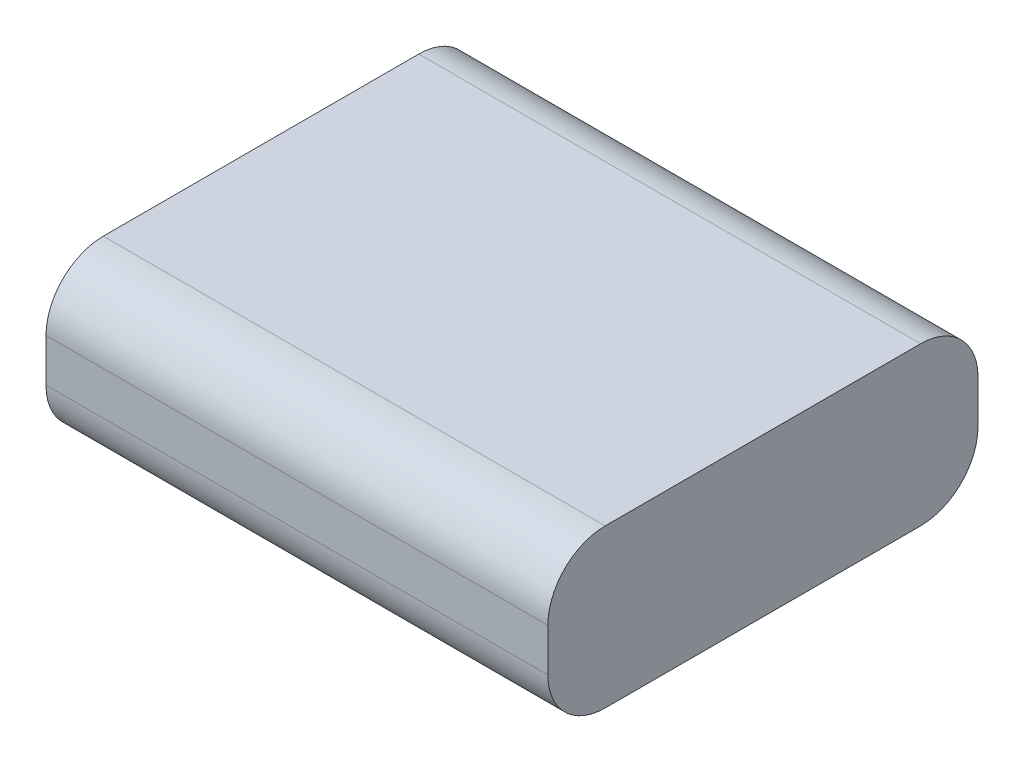
ISO-10303-21;
HEADER;
FILE_DESCRIPTION(('STEP AP214'),'2;1');
FILE_NAME('part.step','',(''),(''),'','','');
FILE_SCHEMA(('AUTOMOTIVE_DESIGN { 1 0 10303 214 1 1 1 1 }'));
ENDSEC;
DATA;
#1=APPLICATION_CONTEXT('core data for automotive mechanical design processes');
#2=APPLICATION_PROTOCOL_DEFINITION('international standard','automotive_design',2000,#1);
#3=PRODUCT_CONTEXT('',#1,'mechanical');
#4=PRODUCT('Part','Part','',(#3));
#5=PRODUCT_RELATED_PRODUCT_CATEGORY('part','',(#4));
#6=PRODUCT_DEFINITION_FORMATION('','',#4);
#7=PRODUCT_DEFINITION_CONTEXT('part definition',#1,'design');
#8=PRODUCT_DEFINITION('design','',#6,#7);
#9=PRODUCT_DEFINITION_SHAPE('','',#8);
#10=(LENGTH_UNIT() NAMED_UNIT(*) SI_UNIT(.MILLI.,.METRE.));
#11=(NAMED_UNIT(*) PLANE_ANGLE_UNIT() SI_UNIT($,.RADIAN.));
#12=(NAMED_UNIT(*) SI_UNIT($,.STERADIAN.) SOLID_ANGLE_UNIT());
#13=UNCERTAINTY_MEASURE_WITH_UNIT(LENGTH_MEASURE(1.E-05),#10,'distance_accuracy_value','');
#14=(GEOMETRIC_REPRESENTATION_CONTEXT(3) GLOBAL_UNCERTAINTY_ASSIGNED_CONTEXT((#13)) GLOBAL_UNIT_ASSIGNED_CONTEXT((#10,
#11,#12)) REPRESENTATION_CONTEXT('',''));
#15=CARTESIAN_POINT('',(0.,0.,0.));
#16=DIRECTION('',(0.,0.,1.));
#17=DIRECTION('',(1.,0.,0.));
#18=AXIS2_PLACEMENT_3D('',#15,#16,#17);
#19=CARTESIAN_POINT('',(35.,22.,-30.));
#20=DIRECTION('',(-1.,0.,0.));
#21=DIRECTION('',(0.,0.,1.));
#22=AXIS2_PLACEMENT_3D('',#19,#20,#21);
#23=PLANE('',#22);
#24=DIRECTION('',(0.,-1.,0.));
#25=VECTOR('',#24,1.);
#26=CARTESIAN_POINT('',(35.,22.,30.));
#27=LINE('',#26,#25);
#28=CARTESIAN_POINT('',(35.,14.,30.));
#29=VERTEX_POINT('',#28);
#30=CARTESIAN_POINT('',(35.,8.,30.));
#31=VERTEX_POINT('',#30);
#32=EDGE_CURVE('E110',#29,#31,#27,.T.);
#33=ORIENTED_EDGE('',*,*,#32,.T.);
#34=CARTESIAN_POINT('',(35.,8.,22.));
#35=DIRECTION('',(-1.,0.,0.));
#36=DIRECTION('',(0.,0.,1.));
#37=AXIS2_PLACEMENT_3D('',#34,#35,#36);
#38=CIRCLE('',#37,8.);
#39=CARTESIAN_POINT('',(35.,0.,22.));
#40=VERTEX_POINT('',#39);
#41=EDGE_CURVE('E143',#31,#40,#38,.F.);
#42=ORIENTED_EDGE('',*,*,#41,.T.);
#43=DIRECTION('',(0.,0.,-1.));
#44=VECTOR('',#43,1.);
#45=CARTESIAN_POINT('',(35.,0.,-30.));
#46=LINE('',#45,#44);
#47=CARTESIAN_POINT('',(35.,0.,-22.));
#48=VERTEX_POINT('',#47);
#49=EDGE_CURVE('E170',#40,#48,#46,.T.);
#50=ORIENTED_EDGE('',*,*,#49,.T.);
#51=CARTESIAN_POINT('',(35.,8.,-22.));
#52=DIRECTION('',(-1.,0.,0.));
#53=DIRECTION('',(0.,0.,1.));
#54=AXIS2_PLACEMENT_3D('',#51,#52,#53);
#55=CIRCLE('',#54,8.);
#56=CARTESIAN_POINT('',(35.,8.,-30.));
#57=VERTEX_POINT('',#56);
#58=EDGE_CURVE('E116',#48,#57,#55,.F.);
#59=ORIENTED_EDGE('',*,*,#58,.T.);
#60=DIRECTION('',(0.,-1.,0.));
#61=VECTOR('',#60,1.);
#62=CARTESIAN_POINT('',(35.,22.,-30.));
#63=LINE('',#62,#61);
#64=CARTESIAN_POINT('',(35.,14.,-30.));
#65=VERTEX_POINT('',#64);
#66=EDGE_CURVE('E133',#65,#57,#63,.T.);
#67=ORIENTED_EDGE('',*,*,#66,.F.);
#68=CARTESIAN_POINT('',(35.,14.,-22.));
#69=DIRECTION('',(-1.,0.,0.));
#70=DIRECTION('',(0.,0.,1.));
#71=AXIS2_PLACEMENT_3D('',#68,#69,#70);
#72=CIRCLE('',#71,8.);
#73=CARTESIAN_POINT('',(35.,22.,-22.));
#74=VERTEX_POINT('',#73);
#75=EDGE_CURVE('E117',#65,#74,#72,.F.);
#76=ORIENTED_EDGE('',*,*,#75,.T.);
#77=DIRECTION('',(0.,0.,-1.));
#78=VECTOR('',#77,1.);
#79=CARTESIAN_POINT('',(35.,22.,-30.));
#80=LINE('',#79,#78);
#81=CARTESIAN_POINT('',(35.,22.,22.));
#82=VERTEX_POINT('',#81);
#83=EDGE_CURVE('E112',#82,#74,#80,.T.);
#84=ORIENTED_EDGE('',*,*,#83,.F.);
#85=CARTESIAN_POINT('',(35.,14.,22.));
#86=DIRECTION('',(-1.,0.,0.));
#87=DIRECTION('',(0.,0.,1.));
#88=AXIS2_PLACEMENT_3D('',#85,#86,#87);
#89=CIRCLE('',#88,8.);
#90=EDGE_CURVE('E108',#82,#29,#89,.F.);
#91=ORIENTED_EDGE('',*,*,#90,.T.);
#92=EDGE_LOOP('',(#33,#42,#50,#59,#67,#76,#84,#91));
#93=FACE_BOUND('',#92,.T.);
#94=ADVANCED_FACE('F41',(#93),#23,.F.);
#95=CARTESIAN_POINT('',(-35.,22.,-30.));
#96=DIRECTION('',(0.,0.,1.));
#97=DIRECTION('',(1.,0.,0.));
#98=AXIS2_PLACEMENT_3D('',#95,#96,#97);
#99=PLANE('',#98);
#100=ORIENTED_EDGE('',*,*,#66,.T.);
#101=DIRECTION('',(-1.,0.,0.));
#102=VECTOR('',#101,1.);
#103=CARTESIAN_POINT('',(-35.,8.,-30.));
#104=LINE('',#103,#102);
#105=CARTESIAN_POINT('',(-35.,8.,-30.));
#106=VERTEX_POINT('',#105);
#107=EDGE_CURVE('E156',#57,#106,#104,.T.);
#108=ORIENTED_EDGE('',*,*,#107,.T.);
#109=DIRECTION('',(0.,-1.,0.));
#110=VECTOR('',#109,1.);
#111=CARTESIAN_POINT('',(-35.,22.,-30.));
#112=LINE('',#111,#110);
#113=CARTESIAN_POINT('',(-35.,14.,-30.));
#114=VERTEX_POINT('',#113);
#115=EDGE_CURVE('E137',#114,#106,#112,.T.);
#116=ORIENTED_EDGE('',*,*,#115,.F.);
#117=DIRECTION('',(-1.,0.,0.));
#118=VECTOR('',#117,1.);
#119=CARTESIAN_POINT('',(35.,14.,-30.));
#120=LINE('',#119,#118);
#121=EDGE_CURVE('E154',#114,#65,#120,.F.);
#122=ORIENTED_EDGE('',*,*,#121,.T.);
#123=EDGE_LOOP('',(#100,#108,#116,#122));
#124=FACE_BOUND('',#123,.T.);
#125=ADVANCED_FACE('F177',(#124),#99,.F.);
#126=CARTESIAN_POINT('',(-35.,22.,-30.));
#127=DIRECTION('',(1.,0.,0.));
#128=DIRECTION('',(0.,0.,-1.));
#129=AXIS2_PLACEMENT_3D('',#126,#127,#128);
#130=PLANE('',#129);
#131=DIRECTION('',(0.,0.,1.));
#132=VECTOR('',#131,1.);
#133=CARTESIAN_POINT('',(-35.,0.,-30.));
#134=LINE('',#133,#132);
#135=CARTESIAN_POINT('',(-35.,0.,-22.));
#136=VERTEX_POINT('',#135);
#137=CARTESIAN_POINT('',(-35.,0.,22.));
#138=VERTEX_POINT('',#137);
#139=EDGE_CURVE('E167',#136,#138,#134,.T.);
#140=ORIENTED_EDGE('',*,*,#139,.T.);
#141=CARTESIAN_POINT('',(-35.,8.,22.));
#142=DIRECTION('',(1.,0.,0.));
#143=DIRECTION('',(0.,0.,-1.));
#144=AXIS2_PLACEMENT_3D('',#141,#142,#143);
#145=CIRCLE('',#144,8.);
#146=CARTESIAN_POINT('',(-35.,8.,30.));
#147=VERTEX_POINT('',#146);
#148=EDGE_CURVE('E152',#138,#147,#145,.F.);
#149=ORIENTED_EDGE('',*,*,#148,.T.);
#150=DIRECTION('',(0.,-1.,0.));
#151=VECTOR('',#150,1.);
#152=CARTESIAN_POINT('',(-35.,22.,30.));
#153=LINE('',#152,#151);
#154=CARTESIAN_POINT('',(-35.,14.,30.));
#155=VERTEX_POINT('',#154);
#156=EDGE_CURVE('E127',#155,#147,#153,.T.);
#157=ORIENTED_EDGE('',*,*,#156,.F.);
#158=CARTESIAN_POINT('',(-35.,14.,22.));
#159=DIRECTION('',(1.,0.,0.));
#160=DIRECTION('',(0.,0.,-1.));
#161=AXIS2_PLACEMENT_3D('',#158,#159,#160);
#162=CIRCLE('',#161,8.);
#163=CARTESIAN_POINT('',(-35.,22.,22.));
#164=VERTEX_POINT('',#163);
#165=EDGE_CURVE('E132',#155,#164,#162,.F.);
#166=ORIENTED_EDGE('',*,*,#165,.T.);
#167=DIRECTION('',(0.,0.,1.));
#168=VECTOR('',#167,1.);
#169=CARTESIAN_POINT('',(-35.,22.,-30.));
#170=LINE('',#169,#168);
#171=CARTESIAN_POINT('',(-35.,22.,-22.));
#172=VERTEX_POINT('',#171);
#173=EDGE_CURVE('E128',#172,#164,#170,.T.);
#174=ORIENTED_EDGE('',*,*,#173,.F.);
#175=CARTESIAN_POINT('',(-35.,14.,-22.));
#176=DIRECTION('',(1.,0.,0.));
#177=DIRECTION('',(0.,0.,-1.));
#178=AXIS2_PLACEMENT_3D('',#175,#176,#177);
#179=CIRCLE('',#178,8.);
#180=EDGE_CURVE('E64',#172,#114,#179,.F.);
#181=ORIENTED_EDGE('',*,*,#180,.T.);
#182=ORIENTED_EDGE('',*,*,#115,.T.);
#183=CARTESIAN_POINT('',(-35.,8.,-22.));
#184=DIRECTION('',(1.,0.,0.));
#185=DIRECTION('',(0.,0.,-1.));
#186=AXIS2_PLACEMENT_3D('',#183,#184,#185);
#187=CIRCLE('',#186,8.);
#188=EDGE_CURVE('E56',#106,#136,#187,.F.);
#189=ORIENTED_EDGE('',*,*,#188,.T.);
#190=EDGE_LOOP('',(#140,#149,#157,#166,#174,#181,#182,#189));
#191=FACE_BOUND('',#190,.T.);
#192=ADVANCED_FACE('F165',(#191),#130,.F.);
#193=CARTESIAN_POINT('',(-35.,22.,30.));
#194=DIRECTION('',(0.,0.,-1.));
#195=DIRECTION('',(-1.,0.,0.));
#196=AXIS2_PLACEMENT_3D('',#193,#194,#195);
#197=PLANE('',#196);
#198=ORIENTED_EDGE('',*,*,#156,.T.);
#199=DIRECTION('',(1.,0.,0.));
#200=VECTOR('',#199,1.);
#201=CARTESIAN_POINT('',(-35.,8.,30.));
#202=LINE('',#201,#200);
#203=EDGE_CURVE('E126',#147,#31,#202,.T.);
#204=ORIENTED_EDGE('',*,*,#203,.T.);
#205=ORIENTED_EDGE('',*,*,#32,.F.);
#206=DIRECTION('',(1.,0.,0.));
#207=VECTOR('',#206,1.);
#208=CARTESIAN_POINT('',(-35.,14.,30.));
#209=LINE('',#208,#207);
#210=EDGE_CURVE('E123',#29,#155,#209,.F.);
#211=ORIENTED_EDGE('',*,*,#210,.T.);
#212=EDGE_LOOP('',(#198,#204,#205,#211));
#213=FACE_BOUND('',#212,.T.);
#214=ADVANCED_FACE('F122',(#213),#197,.F.);
#215=CARTESIAN_POINT('',(0.,22.,0.));
#216=DIRECTION('',(0.,1.,0.));
#217=DIRECTION('',(0.,0.,1.));
#218=AXIS2_PLACEMENT_3D('',#215,#216,#217);
#219=PLANE('',#218);
#220=ORIENTED_EDGE('',*,*,#173,.T.);
#221=DIRECTION('',(1.,0.,0.));
#222=VECTOR('',#221,1.);
#223=CARTESIAN_POINT('',(35.,22.,22.));
#224=LINE('',#223,#222);
#225=EDGE_CURVE('E11',#164,#82,#224,.T.);
#226=ORIENTED_EDGE('',*,*,#225,.T.);
#227=ORIENTED_EDGE('',*,*,#83,.T.);
#228=DIRECTION('',(-1.,0.,0.));
#229=VECTOR('',#228,1.);
#230=CARTESIAN_POINT('',(-35.,22.,-22.));
#231=LINE('',#230,#229);
#232=EDGE_CURVE('E49',#74,#172,#231,.T.);
#233=ORIENTED_EDGE('',*,*,#232,.T.);
#234=EDGE_LOOP('',(#220,#226,#227,#233));
#235=FACE_BOUND('',#234,.T.);
#236=ADVANCED_FACE('F161',(#235),#219,.T.);
#237=CARTESIAN_POINT('',(0.,0.,0.));
#238=DIRECTION('',(0.,1.,0.));
#239=DIRECTION('',(0.,0.,1.));
#240=AXIS2_PLACEMENT_3D('',#237,#238,#239);
#241=PLANE('',#240);
#242=ORIENTED_EDGE('',*,*,#49,.F.);
#243=DIRECTION('',(1.,0.,0.));
#244=VECTOR('',#243,1.);
#245=CARTESIAN_POINT('',(0.,0.,22.));
#246=LINE('',#245,#244);
#247=EDGE_CURVE('E147',#40,#138,#246,.F.);
#248=ORIENTED_EDGE('',*,*,#247,.T.);
#249=ORIENTED_EDGE('',*,*,#139,.F.);
#250=DIRECTION('',(-1.,0.,0.));
#251=VECTOR('',#250,1.);
#252=CARTESIAN_POINT('',(0.,0.,-22.));
#253=LINE('',#252,#251);
#254=EDGE_CURVE('E145',#136,#48,#253,.F.);
#255=ORIENTED_EDGE('',*,*,#254,.T.);
#256=EDGE_LOOP('',(#242,#248,#249,#255));
#257=FACE_BOUND('',#256,.T.);
#258=ADVANCED_FACE('F183',(#257),#241,.F.);
#259=CARTESIAN_POINT('',(-35.,8.,22.));
#260=DIRECTION('',(1.,0.,0.));
#261=DIRECTION('',(0.,0.,-1.));
#262=AXIS2_PLACEMENT_3D('',#259,#260,#261);
#263=CYLINDRICAL_SURFACE('',#262,8.);
#264=ORIENTED_EDGE('',*,*,#148,.F.);
#265=ORIENTED_EDGE('',*,*,#247,.F.);
#266=ORIENTED_EDGE('',*,*,#41,.F.);
#267=ORIENTED_EDGE('',*,*,#203,.F.);
#268=EDGE_LOOP('',(#264,#265,#266,#267));
#269=FACE_BOUND('',#268,.T.);
#270=ADVANCED_FACE('F187',(#269),#263,.T.);
#271=CARTESIAN_POINT('',(-35.,8.,-22.));
#272=DIRECTION('',(-1.,0.,0.));
#273=DIRECTION('',(0.,0.,1.));
#274=AXIS2_PLACEMENT_3D('',#271,#272,#273);
#275=CYLINDRICAL_SURFACE('',#274,8.);
#276=ORIENTED_EDGE('',*,*,#58,.F.);
#277=ORIENTED_EDGE('',*,*,#254,.F.);
#278=ORIENTED_EDGE('',*,*,#188,.F.);
#279=ORIENTED_EDGE('',*,*,#107,.F.);
#280=EDGE_LOOP('',(#276,#277,#278,#279));
#281=FACE_BOUND('',#280,.T.);
#282=ADVANCED_FACE('F180',(#281),#275,.T.);
#283=CARTESIAN_POINT('',(0.,14.,22.));
#284=DIRECTION('',(-1.,0.,0.));
#285=DIRECTION('',(0.,0.,1.));
#286=AXIS2_PLACEMENT_3D('',#283,#284,#285);
#287=CYLINDRICAL_SURFACE('',#286,8.);
#288=ORIENTED_EDGE('',*,*,#165,.F.);
#289=ORIENTED_EDGE('',*,*,#210,.F.);
#290=ORIENTED_EDGE('',*,*,#90,.F.);
#291=ORIENTED_EDGE('',*,*,#225,.F.);
#292=EDGE_LOOP('',(#288,#289,#290,#291));
#293=FACE_BOUND('',#292,.T.);
#294=ADVANCED_FACE('F131',(#293),#287,.T.);
#295=CARTESIAN_POINT('',(0.,14.,-22.));
#296=DIRECTION('',(1.,0.,0.));
#297=DIRECTION('',(0.,0.,-1.));
#298=AXIS2_PLACEMENT_3D('',#295,#296,#297);
#299=CYLINDRICAL_SURFACE('',#298,8.);
#300=ORIENTED_EDGE('',*,*,#75,.F.);
#301=ORIENTED_EDGE('',*,*,#121,.F.);
#302=ORIENTED_EDGE('',*,*,#180,.F.);
#303=ORIENTED_EDGE('',*,*,#232,.F.);
#304=EDGE_LOOP('',(#300,#301,#302,#303));
#305=FACE_BOUND('',#304,.T.);
#306=ADVANCED_FACE('F43',(#305),#299,.T.);
#307=CLOSED_SHELL('',(#94,#125,#192,#214,#236,#258,#270,#282,#294,#306));
#308=MANIFOLD_SOLID_BREP('B2',#307);
#309=ADVANCED_BREP_SHAPE_REPRESENTATION('',(#18,#308),#14);
#310=SHAPE_DEFINITION_REPRESENTATION(#9,#309);
ENDSEC;
END-ISO-10303-21;
